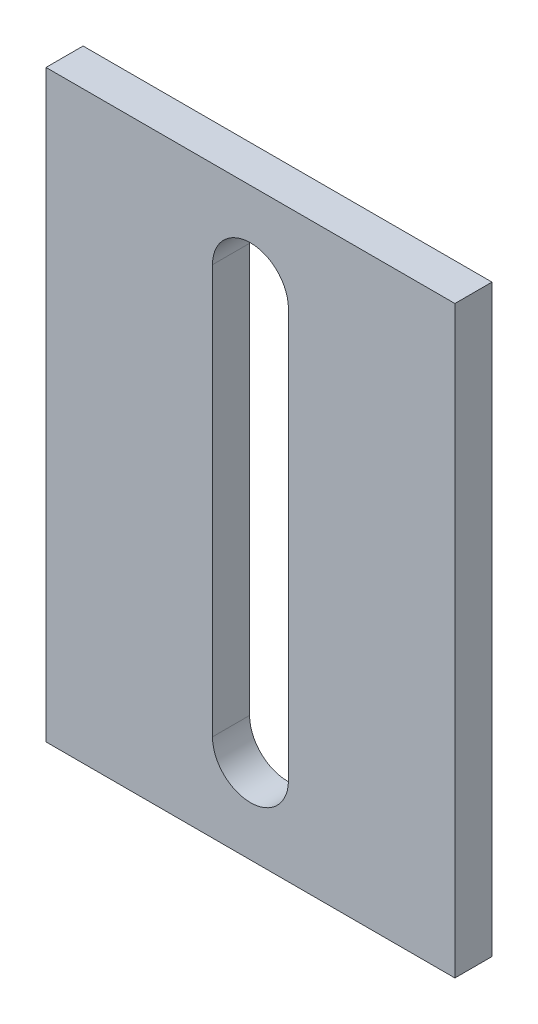
ISO-10303-21;
HEADER;
FILE_DESCRIPTION(('STEP AP214'),'2;1');
FILE_NAME('part.step','',(''),(''),'','','');
FILE_SCHEMA(('AUTOMOTIVE_DESIGN { 1 0 10303 214 1 1 1 1 }'));
ENDSEC;
DATA;
#1=APPLICATION_CONTEXT('core data for automotive mechanical design processes');
#2=APPLICATION_PROTOCOL_DEFINITION('international standard','automotive_design',2000,#1);
#3=PRODUCT_CONTEXT('',#1,'mechanical');
#4=PRODUCT('Part','Part','',(#3));
#5=PRODUCT_RELATED_PRODUCT_CATEGORY('part','',(#4));
#6=PRODUCT_DEFINITION_FORMATION('','',#4);
#7=PRODUCT_DEFINITION_CONTEXT('part definition',#1,'design');
#8=PRODUCT_DEFINITION('design','',#6,#7);
#9=PRODUCT_DEFINITION_SHAPE('','',#8);
#10=(LENGTH_UNIT() NAMED_UNIT(*) SI_UNIT(.MILLI.,.METRE.));
#11=(NAMED_UNIT(*) PLANE_ANGLE_UNIT() SI_UNIT($,.RADIAN.));
#12=(NAMED_UNIT(*) SI_UNIT($,.STERADIAN.) SOLID_ANGLE_UNIT());
#13=UNCERTAINTY_MEASURE_WITH_UNIT(LENGTH_MEASURE(1.E-05),#10,'distance_accuracy_value','');
#14=(GEOMETRIC_REPRESENTATION_CONTEXT(3) GLOBAL_UNCERTAINTY_ASSIGNED_CONTEXT((#13)) GLOBAL_UNIT_ASSIGNED_CONTEXT((#10,
#11,#12)) REPRESENTATION_CONTEXT('',''));
#15=CARTESIAN_POINT('',(0.,0.,0.));
#16=DIRECTION('',(0.,0.,1.));
#17=DIRECTION('',(1.,0.,0.));
#18=AXIS2_PLACEMENT_3D('',#15,#16,#17);
#19=CARTESIAN_POINT('',(0.,0.,6.35));
#20=DIRECTION('',(0.,0.,1.));
#21=DIRECTION('',(1.,0.,0.));
#22=AXIS2_PLACEMENT_3D('',#19,#20,#21);
#23=PLANE('',#22);
#24=DIRECTION('',(0.,-1.,0.));
#25=VECTOR('',#24,1.);
#26=CARTESIAN_POINT('',(-35.,-50.,6.35));
#27=LINE('',#26,#25);
#28=CARTESIAN_POINT('',(-35.,50.,6.35));
#29=VERTEX_POINT('',#28);
#30=CARTESIAN_POINT('',(-35.,-50.,6.35));
#31=VERTEX_POINT('',#30);
#32=EDGE_CURVE('E134',#29,#31,#27,.T.);
#33=ORIENTED_EDGE('',*,*,#32,.T.);
#34=DIRECTION('',(1.,0.,0.));
#35=VECTOR('',#34,1.);
#36=CARTESIAN_POINT('',(35.,-50.,6.35));
#37=LINE('',#36,#35);
#38=CARTESIAN_POINT('',(35.,-50.,6.35));
#39=VERTEX_POINT('',#38);
#40=EDGE_CURVE('E137',#31,#39,#37,.T.);
#41=ORIENTED_EDGE('',*,*,#40,.T.);
#42=DIRECTION('',(0.,1.,0.));
#43=VECTOR('',#42,1.);
#44=CARTESIAN_POINT('',(35.,-50.,6.35));
#45=LINE('',#44,#43);
#46=CARTESIAN_POINT('',(35.,50.,6.35));
#47=VERTEX_POINT('',#46);
#48=EDGE_CURVE('E140',#39,#47,#45,.T.);
#49=ORIENTED_EDGE('',*,*,#48,.T.);
#50=DIRECTION('',(-1.,0.,0.));
#51=VECTOR('',#50,1.);
#52=CARTESIAN_POINT('',(35.,50.,6.35));
#53=LINE('',#52,#51);
#54=EDGE_CURVE('E142',#47,#29,#53,.T.);
#55=ORIENTED_EDGE('',*,*,#54,.T.);
#56=EDGE_LOOP('',(#33,#41,#49,#55));
#57=FACE_BOUND('',#56,.T.);
#58=DIRECTION('',(0.,1.,0.));
#59=VECTOR('',#58,1.);
#60=CARTESIAN_POINT('',(6.5,-35.,6.35));
#61=LINE('',#60,#59);
#62=CARTESIAN_POINT('',(6.5,-35.,6.35));
#63=VERTEX_POINT('',#62);
#64=CARTESIAN_POINT('',(6.49999999999999,35.,6.35));
#65=VERTEX_POINT('',#64);
#66=EDGE_CURVE('E106',#63,#65,#61,.T.);
#67=ORIENTED_EDGE('',*,*,#66,.F.);
#68=CARTESIAN_POINT('',(0.,-35.,6.35));
#69=DIRECTION('',(0.,0.,1.));
#70=DIRECTION('',(1.,0.,0.));
#71=AXIS2_PLACEMENT_3D('',#68,#69,#70);
#72=CIRCLE('',#71,6.5);
#73=CARTESIAN_POINT('',(-6.5,-35.,6.35));
#74=VERTEX_POINT('',#73);
#75=EDGE_CURVE('E98',#74,#63,#72,.T.);
#76=ORIENTED_EDGE('',*,*,#75,.F.);
#77=DIRECTION('',(0.,-1.,0.));
#78=VECTOR('',#77,1.);
#79=CARTESIAN_POINT('',(-6.5,-35.,6.35));
#80=LINE('',#79,#78);
#81=CARTESIAN_POINT('',(-6.50000000000001,35.,6.35));
#82=VERTEX_POINT('',#81);
#83=EDGE_CURVE('E120',#82,#74,#80,.T.);
#84=ORIENTED_EDGE('',*,*,#83,.F.);
#85=CARTESIAN_POINT('',(0.,35.,6.35));
#86=DIRECTION('',(0.,0.,1.));
#87=DIRECTION('',(1.,0.,0.));
#88=AXIS2_PLACEMENT_3D('',#85,#86,#87);
#89=CIRCLE('',#88,6.5);
#90=EDGE_CURVE('E118',#65,#82,#89,.T.);
#91=ORIENTED_EDGE('',*,*,#90,.F.);
#92=EDGE_LOOP('',(#67,#76,#84,#91));
#93=FACE_BOUND('',#92,.T.);
#94=ADVANCED_FACE('F33',(#57,#93),#23,.T.);
#95=CARTESIAN_POINT('',(0.,0.,0.));
#96=DIRECTION('',(0.,0.,1.));
#97=DIRECTION('',(1.,0.,0.));
#98=AXIS2_PLACEMENT_3D('',#95,#96,#97);
#99=PLANE('',#98);
#100=DIRECTION('',(0.,-1.,0.));
#101=VECTOR('',#100,1.);
#102=CARTESIAN_POINT('',(-35.,-50.,0.));
#103=LINE('',#102,#101);
#104=CARTESIAN_POINT('',(-35.,50.,0.));
#105=VERTEX_POINT('',#104);
#106=CARTESIAN_POINT('',(-35.,-50.,0.));
#107=VERTEX_POINT('',#106);
#108=EDGE_CURVE('E114',#105,#107,#103,.T.);
#109=ORIENTED_EDGE('',*,*,#108,.F.);
#110=DIRECTION('',(-1.,0.,0.));
#111=VECTOR('',#110,1.);
#112=CARTESIAN_POINT('',(35.,50.,0.));
#113=LINE('',#112,#111);
#114=CARTESIAN_POINT('',(35.,50.,0.));
#115=VERTEX_POINT('',#114);
#116=EDGE_CURVE('E138',#115,#105,#113,.T.);
#117=ORIENTED_EDGE('',*,*,#116,.F.);
#118=DIRECTION('',(0.,1.,0.));
#119=VECTOR('',#118,1.);
#120=CARTESIAN_POINT('',(35.,-50.,0.));
#121=LINE('',#120,#119);
#122=CARTESIAN_POINT('',(35.,-50.,0.));
#123=VERTEX_POINT('',#122);
#124=EDGE_CURVE('E149',#123,#115,#121,.T.);
#125=ORIENTED_EDGE('',*,*,#124,.F.);
#126=DIRECTION('',(1.,0.,0.));
#127=VECTOR('',#126,1.);
#128=CARTESIAN_POINT('',(35.,-50.,0.));
#129=LINE('',#128,#127);
#130=EDGE_CURVE('E147',#107,#123,#129,.T.);
#131=ORIENTED_EDGE('',*,*,#130,.F.);
#132=EDGE_LOOP('',(#109,#117,#125,#131));
#133=FACE_BOUND('',#132,.T.);
#134=CARTESIAN_POINT('',(0.,-35.,0.));
#135=DIRECTION('',(0.,0.,1.));
#136=DIRECTION('',(1.,0.,0.));
#137=AXIS2_PLACEMENT_3D('',#134,#135,#136);
#138=CIRCLE('',#137,6.5);
#139=CARTESIAN_POINT('',(-6.5,-35.,0.));
#140=VERTEX_POINT('',#139);
#141=CARTESIAN_POINT('',(6.5,-35.,0.));
#142=VERTEX_POINT('',#141);
#143=EDGE_CURVE('E56',#140,#142,#138,.T.);
#144=ORIENTED_EDGE('',*,*,#143,.T.);
#145=DIRECTION('',(0.,1.,0.));
#146=VECTOR('',#145,1.);
#147=CARTESIAN_POINT('',(6.5,-35.,0.));
#148=LINE('',#147,#146);
#149=CARTESIAN_POINT('',(6.49999999999999,35.,0.));
#150=VERTEX_POINT('',#149);
#151=EDGE_CURVE('E113',#142,#150,#148,.T.);
#152=ORIENTED_EDGE('',*,*,#151,.T.);
#153=CARTESIAN_POINT('',(0.,35.,0.));
#154=DIRECTION('',(0.,0.,1.));
#155=DIRECTION('',(1.,0.,0.));
#156=AXIS2_PLACEMENT_3D('',#153,#154,#155);
#157=CIRCLE('',#156,6.5);
#158=CARTESIAN_POINT('',(-6.50000000000001,35.,0.));
#159=VERTEX_POINT('',#158);
#160=EDGE_CURVE('E126',#150,#159,#157,.T.);
#161=ORIENTED_EDGE('',*,*,#160,.T.);
#162=DIRECTION('',(0.,-1.,0.));
#163=VECTOR('',#162,1.);
#164=CARTESIAN_POINT('',(-6.5,-35.,0.));
#165=LINE('',#164,#163);
#166=EDGE_CURVE('E107',#159,#140,#165,.T.);
#167=ORIENTED_EDGE('',*,*,#166,.T.);
#168=EDGE_LOOP('',(#144,#152,#161,#167));
#169=FACE_BOUND('',#168,.T.);
#170=ADVANCED_FACE('F167',(#133,#169),#99,.F.);
#171=CARTESIAN_POINT('',(-35.,-50.,6.35));
#172=DIRECTION('',(1.,0.,0.));
#173=DIRECTION('',(0.,1.,0.));
#174=AXIS2_PLACEMENT_3D('',#171,#172,#173);
#175=PLANE('',#174);
#176=ORIENTED_EDGE('',*,*,#108,.T.);
#177=DIRECTION('',(0.,0.,-1.));
#178=VECTOR('',#177,1.);
#179=CARTESIAN_POINT('',(-35.,-50.,6.35));
#180=LINE('',#179,#178);
#181=EDGE_CURVE('E11',#31,#107,#180,.T.);
#182=ORIENTED_EDGE('',*,*,#181,.F.);
#183=ORIENTED_EDGE('',*,*,#32,.F.);
#184=DIRECTION('',(0.,0.,-1.));
#185=VECTOR('',#184,1.);
#186=CARTESIAN_POINT('',(-35.,50.,6.35));
#187=LINE('',#186,#185);
#188=EDGE_CURVE('E144',#29,#105,#187,.T.);
#189=ORIENTED_EDGE('',*,*,#188,.T.);
#190=EDGE_LOOP('',(#176,#182,#183,#189));
#191=FACE_BOUND('',#190,.T.);
#192=ADVANCED_FACE('F35',(#191),#175,.F.);
#193=CARTESIAN_POINT('',(35.,-50.,6.35));
#194=DIRECTION('',(0.,1.,0.));
#195=DIRECTION('',(-1.,0.,0.));
#196=AXIS2_PLACEMENT_3D('',#193,#194,#195);
#197=PLANE('',#196);
#198=ORIENTED_EDGE('',*,*,#130,.T.);
#199=DIRECTION('',(0.,0.,-1.));
#200=VECTOR('',#199,1.);
#201=CARTESIAN_POINT('',(35.,-50.,6.35));
#202=LINE('',#201,#200);
#203=EDGE_CURVE('E41',#39,#123,#202,.T.);
#204=ORIENTED_EDGE('',*,*,#203,.F.);
#205=ORIENTED_EDGE('',*,*,#40,.F.);
#206=ORIENTED_EDGE('',*,*,#181,.T.);
#207=EDGE_LOOP('',(#198,#204,#205,#206));
#208=FACE_BOUND('',#207,.T.);
#209=ADVANCED_FACE('F177',(#208),#197,.F.);
#210=CARTESIAN_POINT('',(35.,-50.,6.35));
#211=DIRECTION('',(-1.,0.,0.));
#212=DIRECTION('',(0.,0.,1.));
#213=AXIS2_PLACEMENT_3D('',#210,#211,#212);
#214=PLANE('',#213);
#215=ORIENTED_EDGE('',*,*,#124,.T.);
#216=DIRECTION('',(0.,0.,-1.));
#217=VECTOR('',#216,1.);
#218=CARTESIAN_POINT('',(35.,50.,6.35));
#219=LINE('',#218,#217);
#220=EDGE_CURVE('E154',#47,#115,#219,.T.);
#221=ORIENTED_EDGE('',*,*,#220,.F.);
#222=ORIENTED_EDGE('',*,*,#48,.F.);
#223=ORIENTED_EDGE('',*,*,#203,.T.);
#224=EDGE_LOOP('',(#215,#221,#222,#223));
#225=FACE_BOUND('',#224,.T.);
#226=ADVANCED_FACE('F161',(#225),#214,.F.);
#227=CARTESIAN_POINT('',(35.,50.,6.35));
#228=DIRECTION('',(0.,-1.,0.));
#229=DIRECTION('',(1.,0.,0.));
#230=AXIS2_PLACEMENT_3D('',#227,#228,#229);
#231=PLANE('',#230);
#232=ORIENTED_EDGE('',*,*,#116,.T.);
#233=ORIENTED_EDGE('',*,*,#188,.F.);
#234=ORIENTED_EDGE('',*,*,#54,.F.);
#235=ORIENTED_EDGE('',*,*,#220,.T.);
#236=EDGE_LOOP('',(#232,#233,#234,#235));
#237=FACE_BOUND('',#236,.T.);
#238=ADVANCED_FACE('F171',(#237),#231,.F.);
#239=CARTESIAN_POINT('',(0.,-35.,6.35));
#240=DIRECTION('',(0.,0.,-1.));
#241=DIRECTION('',(-1.,0.,0.));
#242=AXIS2_PLACEMENT_3D('',#239,#240,#241);
#243=CYLINDRICAL_SURFACE('',#242,6.5);
#244=ORIENTED_EDGE('',*,*,#143,.F.);
#245=DIRECTION('',(0.,0.,-1.));
#246=VECTOR('',#245,1.);
#247=CARTESIAN_POINT('',(-6.5,-35.,6.35));
#248=LINE('',#247,#246);
#249=EDGE_CURVE('E102',#74,#140,#248,.T.);
#250=ORIENTED_EDGE('',*,*,#249,.F.);
#251=ORIENTED_EDGE('',*,*,#75,.T.);
#252=DIRECTION('',(0.,0.,-1.));
#253=VECTOR('',#252,1.);
#254=CARTESIAN_POINT('',(6.5,-35.,6.35));
#255=LINE('',#254,#253);
#256=EDGE_CURVE('E101',#63,#142,#255,.T.);
#257=ORIENTED_EDGE('',*,*,#256,.T.);
#258=EDGE_LOOP('',(#244,#250,#251,#257));
#259=FACE_BOUND('',#258,.T.);
#260=ADVANCED_FACE('F100',(#259),#243,.F.);
#261=CARTESIAN_POINT('',(6.5,-35.,6.35));
#262=DIRECTION('',(-1.,0.,0.));
#263=DIRECTION('',(0.,-1.,0.));
#264=AXIS2_PLACEMENT_3D('',#261,#262,#263);
#265=PLANE('',#264);
#266=ORIENTED_EDGE('',*,*,#151,.F.);
#267=ORIENTED_EDGE('',*,*,#256,.F.);
#268=ORIENTED_EDGE('',*,*,#66,.T.);
#269=DIRECTION('',(0.,0.,-1.));
#270=VECTOR('',#269,1.);
#271=CARTESIAN_POINT('',(6.49999999999999,35.,6.35));
#272=LINE('',#271,#270);
#273=EDGE_CURVE('E115',#65,#150,#272,.T.);
#274=ORIENTED_EDGE('',*,*,#273,.T.);
#275=EDGE_LOOP('',(#266,#267,#268,#274));
#276=FACE_BOUND('',#275,.T.);
#277=ADVANCED_FACE('F110',(#276),#265,.T.);
#278=CARTESIAN_POINT('',(0.,35.,6.35));
#279=DIRECTION('',(0.,0.,-1.));
#280=DIRECTION('',(-1.,0.,0.));
#281=AXIS2_PLACEMENT_3D('',#278,#279,#280);
#282=CYLINDRICAL_SURFACE('',#281,6.5);
#283=ORIENTED_EDGE('',*,*,#160,.F.);
#284=ORIENTED_EDGE('',*,*,#273,.F.);
#285=ORIENTED_EDGE('',*,*,#90,.T.);
#286=DIRECTION('',(0.,0.,-1.));
#287=VECTOR('',#286,1.);
#288=CARTESIAN_POINT('',(-6.50000000000001,35.,6.35));
#289=LINE('',#288,#287);
#290=EDGE_CURVE('E48',#82,#159,#289,.T.);
#291=ORIENTED_EDGE('',*,*,#290,.T.);
#292=EDGE_LOOP('',(#283,#284,#285,#291));
#293=FACE_BOUND('',#292,.T.);
#294=ADVANCED_FACE('F200',(#293),#282,.F.);
#295=CARTESIAN_POINT('',(-6.5,-35.,6.35));
#296=DIRECTION('',(1.,0.,0.));
#297=DIRECTION('',(0.,1.,0.));
#298=AXIS2_PLACEMENT_3D('',#295,#296,#297);
#299=PLANE('',#298);
#300=ORIENTED_EDGE('',*,*,#166,.F.);
#301=ORIENTED_EDGE('',*,*,#290,.F.);
#302=ORIENTED_EDGE('',*,*,#83,.T.);
#303=ORIENTED_EDGE('',*,*,#249,.T.);
#304=EDGE_LOOP('',(#300,#301,#302,#303));
#305=FACE_BOUND('',#304,.T.);
#306=ADVANCED_FACE('F204',(#305),#299,.T.);
#307=CLOSED_SHELL('',(#94,#170,#192,#209,#226,#238,#260,#277,#294,#306));
#308=MANIFOLD_SOLID_BREP('B2',#307);
#309=ADVANCED_BREP_SHAPE_REPRESENTATION('',(#18,#308),#14);
#310=SHAPE_DEFINITION_REPRESENTATION(#9,#309);
ENDSEC;
END-ISO-10303-21;
